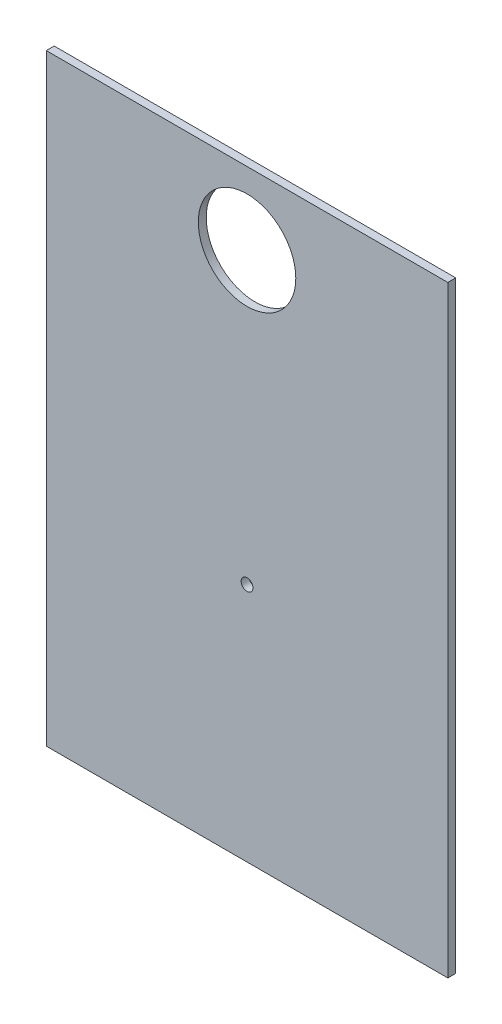
ISO-10303-21;
HEADER;
FILE_DESCRIPTION(('STEP AP214'),'2;1');
FILE_NAME('part.step','',(''),(''),'','','');
FILE_SCHEMA(('AUTOMOTIVE_DESIGN { 1 0 10303 214 1 1 1 1 }'));
ENDSEC;
DATA;
#1=APPLICATION_CONTEXT('core data for automotive mechanical design processes');
#2=APPLICATION_PROTOCOL_DEFINITION('international standard','automotive_design',2000,#1);
#3=PRODUCT_CONTEXT('',#1,'mechanical');
#4=PRODUCT('Part','Part','',(#3));
#5=PRODUCT_RELATED_PRODUCT_CATEGORY('part','',(#4));
#6=PRODUCT_DEFINITION_FORMATION('','',#4);
#7=PRODUCT_DEFINITION_CONTEXT('part definition',#1,'design');
#8=PRODUCT_DEFINITION('design','',#6,#7);
#9=PRODUCT_DEFINITION_SHAPE('','',#8);
#10=(LENGTH_UNIT() NAMED_UNIT(*) SI_UNIT(.MILLI.,.METRE.));
#11=(NAMED_UNIT(*) PLANE_ANGLE_UNIT() SI_UNIT($,.RADIAN.));
#12=(NAMED_UNIT(*) SI_UNIT($,.STERADIAN.) SOLID_ANGLE_UNIT());
#13=UNCERTAINTY_MEASURE_WITH_UNIT(LENGTH_MEASURE(1.E-05),#10,'distance_accuracy_value','');
#14=(GEOMETRIC_REPRESENTATION_CONTEXT(3) GLOBAL_UNCERTAINTY_ASSIGNED_CONTEXT((#13)) GLOBAL_UNIT_ASSIGNED_CONTEXT((#10,
#11,#12)) REPRESENTATION_CONTEXT('',''));
#15=CARTESIAN_POINT('',(0.,0.,0.));
#16=DIRECTION('',(0.,0.,1.));
#17=DIRECTION('',(1.,0.,0.));
#18=AXIS2_PLACEMENT_3D('',#15,#16,#17);
#19=CARTESIAN_POINT('',(-152.4,-228.6,6.));
#20=DIRECTION('',(1.,0.,0.));
#21=DIRECTION('',(0.,0.,-1.));
#22=AXIS2_PLACEMENT_3D('',#19,#20,#21);
#23=PLANE('',#22);
#24=DIRECTION('',(0.,-1.,0.));
#25=VECTOR('',#24,1.);
#26=CARTESIAN_POINT('',(-152.4,-228.6,0.));
#27=LINE('',#26,#25);
#28=CARTESIAN_POINT('',(-152.4,228.6,0.));
#29=VERTEX_POINT('',#28);
#30=CARTESIAN_POINT('',(-152.4,-228.6,0.));
#31=VERTEX_POINT('',#30);
#32=EDGE_CURVE('E96',#29,#31,#27,.T.);
#33=ORIENTED_EDGE('',*,*,#32,.T.);
#34=DIRECTION('',(0.,0.,-1.));
#35=VECTOR('',#34,1.);
#36=CARTESIAN_POINT('',(-152.4,-228.6,6.));
#37=LINE('',#36,#35);
#38=CARTESIAN_POINT('',(-152.4,-228.6,6.));
#39=VERTEX_POINT('',#38);
#40=EDGE_CURVE('E11',#39,#31,#37,.T.);
#41=ORIENTED_EDGE('',*,*,#40,.F.);
#42=DIRECTION('',(0.,-1.,0.));
#43=VECTOR('',#42,1.);
#44=CARTESIAN_POINT('',(-152.4,-228.6,6.));
#45=LINE('',#44,#43);
#46=CARTESIAN_POINT('',(-152.4,228.6,6.));
#47=VERTEX_POINT('',#46);
#48=EDGE_CURVE('E84',#47,#39,#45,.T.);
#49=ORIENTED_EDGE('',*,*,#48,.F.);
#50=DIRECTION('',(0.,0.,-1.));
#51=VECTOR('',#50,1.);
#52=CARTESIAN_POINT('',(-152.4,228.6,6.));
#53=LINE('',#52,#51);
#54=EDGE_CURVE('E92',#47,#29,#53,.T.);
#55=ORIENTED_EDGE('',*,*,#54,.T.);
#56=EDGE_LOOP('',(#33,#41,#49,#55));
#57=FACE_BOUND('',#56,.T.);
#58=ADVANCED_FACE('F33',(#57),#23,.F.);
#59=CARTESIAN_POINT('',(152.4,-228.6,6.));
#60=DIRECTION('',(0.,1.,0.));
#61=DIRECTION('',(0.,0.,1.));
#62=AXIS2_PLACEMENT_3D('',#59,#60,#61);
#63=PLANE('',#62);
#64=DIRECTION('',(1.,0.,0.));
#65=VECTOR('',#64,1.);
#66=CARTESIAN_POINT('',(152.4,-228.6,0.));
#67=LINE('',#66,#65);
#68=CARTESIAN_POINT('',(152.4,-228.6,0.));
#69=VERTEX_POINT('',#68);
#70=EDGE_CURVE('E88',#31,#69,#67,.T.);
#71=ORIENTED_EDGE('',*,*,#70,.T.);
#72=DIRECTION('',(0.,0.,-1.));
#73=VECTOR('',#72,1.);
#74=CARTESIAN_POINT('',(152.4,-228.6,6.));
#75=LINE('',#74,#73);
#76=CARTESIAN_POINT('',(152.4,-228.6,6.));
#77=VERTEX_POINT('',#76);
#78=EDGE_CURVE('E41',#77,#69,#75,.T.);
#79=ORIENTED_EDGE('',*,*,#78,.F.);
#80=DIRECTION('',(1.,0.,0.));
#81=VECTOR('',#80,1.);
#82=CARTESIAN_POINT('',(152.4,-228.6,6.));
#83=LINE('',#82,#81);
#84=EDGE_CURVE('E79',#39,#77,#83,.T.);
#85=ORIENTED_EDGE('',*,*,#84,.F.);
#86=ORIENTED_EDGE('',*,*,#40,.T.);
#87=EDGE_LOOP('',(#71,#79,#85,#86));
#88=FACE_BOUND('',#87,.T.);
#89=ADVANCED_FACE('F87',(#88),#63,.F.);
#90=CARTESIAN_POINT('',(152.4,-228.6,6.));
#91=DIRECTION('',(-1.,0.,0.));
#92=DIRECTION('',(0.,0.,1.));
#93=AXIS2_PLACEMENT_3D('',#90,#91,#92);
#94=PLANE('',#93);
#95=DIRECTION('',(0.,1.,0.));
#96=VECTOR('',#95,1.);
#97=CARTESIAN_POINT('',(152.4,-228.6,0.));
#98=LINE('',#97,#96);
#99=CARTESIAN_POINT('',(152.4,228.6,0.));
#100=VERTEX_POINT('',#99);
#101=EDGE_CURVE('E66',#69,#100,#98,.T.);
#102=ORIENTED_EDGE('',*,*,#101,.T.);
#103=DIRECTION('',(0.,0.,-1.));
#104=VECTOR('',#103,1.);
#105=CARTESIAN_POINT('',(152.4,228.6,6.));
#106=LINE('',#105,#104);
#107=CARTESIAN_POINT('',(152.4,228.6,6.));
#108=VERTEX_POINT('',#107);
#109=EDGE_CURVE('E89',#108,#100,#106,.T.);
#110=ORIENTED_EDGE('',*,*,#109,.F.);
#111=DIRECTION('',(0.,1.,0.));
#112=VECTOR('',#111,1.);
#113=CARTESIAN_POINT('',(152.4,-228.6,6.));
#114=LINE('',#113,#112);
#115=EDGE_CURVE('E82',#77,#108,#114,.T.);
#116=ORIENTED_EDGE('',*,*,#115,.F.);
#117=ORIENTED_EDGE('',*,*,#78,.T.);
#118=EDGE_LOOP('',(#102,#110,#116,#117));
#119=FACE_BOUND('',#118,.T.);
#120=ADVANCED_FACE('F90',(#119),#94,.F.);
#121=CARTESIAN_POINT('',(152.4,228.6,6.));
#122=DIRECTION('',(0.,-1.,0.));
#123=DIRECTION('',(0.,0.,-1.));
#124=AXIS2_PLACEMENT_3D('',#121,#122,#123);
#125=PLANE('',#124);
#126=DIRECTION('',(-1.,0.,0.));
#127=VECTOR('',#126,1.);
#128=CARTESIAN_POINT('',(152.4,228.6,0.));
#129=LINE('',#128,#127);
#130=EDGE_CURVE('E72',#100,#29,#129,.T.);
#131=ORIENTED_EDGE('',*,*,#130,.T.);
#132=ORIENTED_EDGE('',*,*,#54,.F.);
#133=DIRECTION('',(-1.,0.,0.));
#134=VECTOR('',#133,1.);
#135=CARTESIAN_POINT('',(152.4,228.6,6.));
#136=LINE('',#135,#134);
#137=EDGE_CURVE('E49',#108,#47,#136,.T.);
#138=ORIENTED_EDGE('',*,*,#137,.F.);
#139=ORIENTED_EDGE('',*,*,#109,.T.);
#140=EDGE_LOOP('',(#131,#132,#138,#139));
#141=FACE_BOUND('',#140,.T.);
#142=ADVANCED_FACE('F104',(#141),#125,.F.);
#143=CARTESIAN_POINT('',(0.,0.,6.));
#144=DIRECTION('',(0.,0.,1.));
#145=DIRECTION('',(1.,0.,0.));
#146=AXIS2_PLACEMENT_3D('',#143,#144,#145);
#147=PLANE('',#146);
#148=CARTESIAN_POINT('',(0.,-46.2000000000001,6.));
#149=DIRECTION('',(0.,0.,1.));
#150=DIRECTION('',(1.,0.,0.));
#151=AXIS2_PLACEMENT_3D('',#148,#149,#150);
#152=CIRCLE('',#151,4.5);
#153=CARTESIAN_POINT('',(4.5,-46.2000000000001,6.));
#154=VERTEX_POINT('',#153);
#155=EDGE_CURVE('E116',#154,#154,#152,.T.);
#156=ORIENTED_EDGE('',*,*,#155,.F.);
#157=EDGE_LOOP('',(#156));
#158=FACE_BOUND('',#157,.T.);
#159=CARTESIAN_POINT('',(0.,173.6,6.));
#160=DIRECTION('',(0.,0.,1.));
#161=DIRECTION('',(1.,0.,0.));
#162=AXIS2_PLACEMENT_3D('',#159,#160,#161);
#163=CIRCLE('',#162,37.);
#164=CARTESIAN_POINT('',(36.9999999999999,173.6,6.));
#165=VERTEX_POINT('',#164);
#166=EDGE_CURVE('E110',#165,#165,#163,.T.);
#167=ORIENTED_EDGE('',*,*,#166,.F.);
#168=EDGE_LOOP('',(#167));
#169=FACE_BOUND('',#168,.T.);
#170=ORIENTED_EDGE('',*,*,#48,.T.);
#171=ORIENTED_EDGE('',*,*,#84,.T.);
#172=ORIENTED_EDGE('',*,*,#115,.T.);
#173=ORIENTED_EDGE('',*,*,#137,.T.);
#174=EDGE_LOOP('',(#170,#171,#172,#173));
#175=FACE_BOUND('',#174,.T.);
#176=ADVANCED_FACE('F80',(#158,#169,#175),#147,.T.);
#177=CARTESIAN_POINT('',(0.,0.,0.));
#178=DIRECTION('',(0.,0.,1.));
#179=DIRECTION('',(1.,0.,0.));
#180=AXIS2_PLACEMENT_3D('',#177,#178,#179);
#181=PLANE('',#180);
#182=CARTESIAN_POINT('',(0.,-46.2000000000001,0.));
#183=DIRECTION('',(0.,0.,1.));
#184=DIRECTION('',(1.,0.,0.));
#185=AXIS2_PLACEMENT_3D('',#182,#183,#184);
#186=CIRCLE('',#185,4.5);
#187=CARTESIAN_POINT('',(4.5,-46.2000000000001,0.));
#188=VERTEX_POINT('',#187);
#189=EDGE_CURVE('E113',#188,#188,#186,.T.);
#190=ORIENTED_EDGE('',*,*,#189,.T.);
#191=EDGE_LOOP('',(#190));
#192=FACE_BOUND('',#191,.T.);
#193=CARTESIAN_POINT('',(0.,173.6,0.));
#194=DIRECTION('',(0.,0.,1.));
#195=DIRECTION('',(1.,0.,0.));
#196=AXIS2_PLACEMENT_3D('',#193,#194,#195);
#197=CIRCLE('',#196,37.);
#198=CARTESIAN_POINT('',(36.9999999999999,173.6,0.));
#199=VERTEX_POINT('',#198);
#200=EDGE_CURVE('E99',#199,#199,#197,.T.);
#201=ORIENTED_EDGE('',*,*,#200,.T.);
#202=EDGE_LOOP('',(#201));
#203=FACE_BOUND('',#202,.T.);
#204=ORIENTED_EDGE('',*,*,#32,.F.);
#205=ORIENTED_EDGE('',*,*,#130,.F.);
#206=ORIENTED_EDGE('',*,*,#101,.F.);
#207=ORIENTED_EDGE('',*,*,#70,.F.);
#208=EDGE_LOOP('',(#204,#205,#206,#207));
#209=FACE_BOUND('',#208,.T.);
#210=ADVANCED_FACE('F107',(#192,#203,#209),#181,.F.);
#211=CARTESIAN_POINT('',(0.,173.6,0.));
#212=DIRECTION('',(0.,0.,1.));
#213=DIRECTION('',(1.,0.,0.));
#214=AXIS2_PLACEMENT_3D('',#211,#212,#213);
#215=CYLINDRICAL_SURFACE('',#214,37.);
#216=ORIENTED_EDGE('',*,*,#200,.F.);
#217=EDGE_LOOP('',(#216));
#218=FACE_BOUND('',#217,.T.);
#219=ORIENTED_EDGE('',*,*,#166,.T.);
#220=EDGE_LOOP('',(#219));
#221=FACE_BOUND('',#220,.T.);
#222=ADVANCED_FACE('F127',(#218,#221),#215,.F.);
#223=CARTESIAN_POINT('',(0.,-46.2000000000001,0.));
#224=DIRECTION('',(0.,0.,1.));
#225=DIRECTION('',(1.,0.,0.));
#226=AXIS2_PLACEMENT_3D('',#223,#224,#225);
#227=CYLINDRICAL_SURFACE('',#226,4.5);
#228=ORIENTED_EDGE('',*,*,#189,.F.);
#229=EDGE_LOOP('',(#228));
#230=FACE_BOUND('',#229,.T.);
#231=ORIENTED_EDGE('',*,*,#155,.T.);
#232=EDGE_LOOP('',(#231));
#233=FACE_BOUND('',#232,.T.);
#234=ADVANCED_FACE('F124',(#230,#233),#227,.F.);
#235=CLOSED_SHELL('',(#58,#89,#120,#142,#176,#210,#222,#234));
#236=MANIFOLD_SOLID_BREP('B2',#235);
#237=ADVANCED_BREP_SHAPE_REPRESENTATION('',(#18,#236),#14);
#238=SHAPE_DEFINITION_REPRESENTATION(#9,#237);
ENDSEC;
END-ISO-10303-21;
